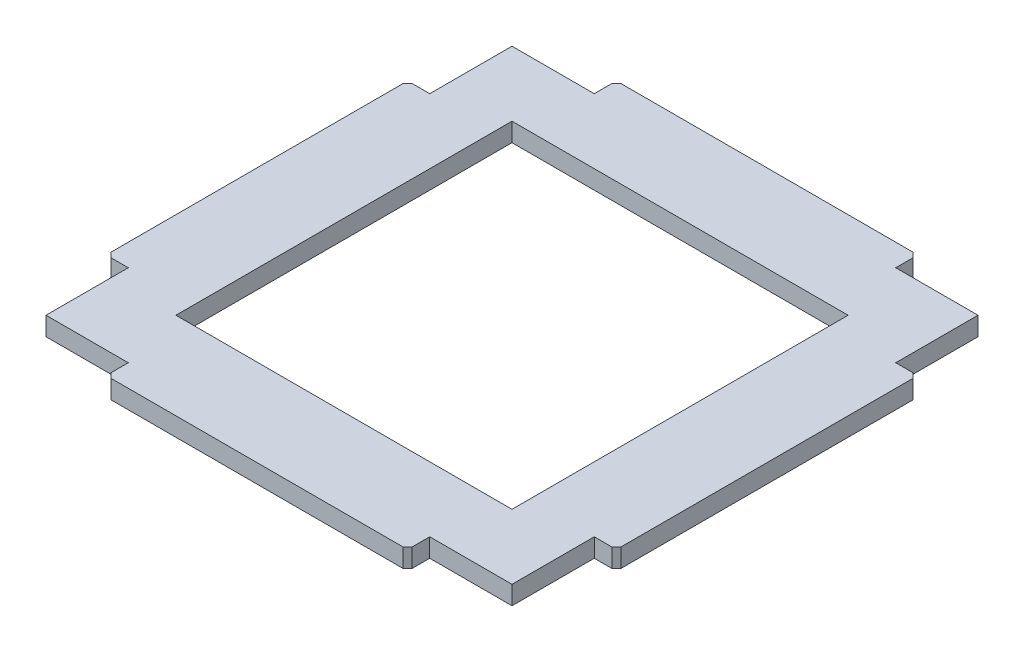
ISO-10303-21;
HEADER;
FILE_DESCRIPTION(('STEP AP214'),'2;1');
FILE_NAME('part.step','',(''),(''),'','','');
FILE_SCHEMA(('AUTOMOTIVE_DESIGN { 1 0 10303 214 1 1 1 1 }'));
ENDSEC;
DATA;
#1=APPLICATION_CONTEXT('core data for automotive mechanical design processes');
#2=APPLICATION_PROTOCOL_DEFINITION('international standard','automotive_design',2000,#1);
#3=PRODUCT_CONTEXT('',#1,'mechanical');
#4=PRODUCT('Part','Part','',(#3));
#5=PRODUCT_RELATED_PRODUCT_CATEGORY('part','',(#4));
#6=PRODUCT_DEFINITION_FORMATION('','',#4);
#7=PRODUCT_DEFINITION_CONTEXT('part definition',#1,'design');
#8=PRODUCT_DEFINITION('design','',#6,#7);
#9=PRODUCT_DEFINITION_SHAPE('','',#8);
#10=(LENGTH_UNIT() NAMED_UNIT(*) SI_UNIT(.MILLI.,.METRE.));
#11=(NAMED_UNIT(*) PLANE_ANGLE_UNIT() SI_UNIT($,.RADIAN.));
#12=(NAMED_UNIT(*) SI_UNIT($,.STERADIAN.) SOLID_ANGLE_UNIT());
#13=UNCERTAINTY_MEASURE_WITH_UNIT(LENGTH_MEASURE(1.E-05),#10,'distance_accuracy_value','');
#14=(GEOMETRIC_REPRESENTATION_CONTEXT(3) GLOBAL_UNCERTAINTY_ASSIGNED_CONTEXT((#13)) GLOBAL_UNIT_ASSIGNED_CONTEXT((#10,
#11,#12)) REPRESENTATION_CONTEXT('',''));
#15=CARTESIAN_POINT('',(0.,0.,0.));
#16=DIRECTION('',(0.,0.,1.));
#17=DIRECTION('',(1.,0.,0.));
#18=AXIS2_PLACEMENT_3D('',#15,#16,#17);
#19=CARTESIAN_POINT('',(0.,4.064,0.));
#20=DIRECTION('',(0.,-1.,0.));
#21=DIRECTION('',(0.,0.,-1.));
#22=AXIS2_PLACEMENT_3D('',#19,#20,#21);
#23=PLANE('',#22);
#24=DIRECTION('',(0.,0.,1.));
#25=VECTOR('',#24,1.);
#26=CARTESIAN_POINT('',(532.384,4.064,-32.8612499999997));
#27=LINE('',#26,#25);
#28=CARTESIAN_POINT('',(532.384,4.064,-31.8452499999997));
#29=VERTEX_POINT('',#28);
#30=CARTESIAN_POINT('',(532.384,4.064,31.8452499999997));
#31=VERTEX_POINT('',#30);
#32=EDGE_CURVE('E320',#29,#31,#27,.T.);
#33=ORIENTED_EDGE('',*,*,#32,.T.);
#34=DIRECTION('',(-0.707106781186557,0.,-0.707106781186538));
#35=VECTOR('',#34,1.);
#36=CARTESIAN_POINT('',(533.4,4.064,32.8612499999997));
#37=LINE('',#36,#35);
#38=CARTESIAN_POINT('',(533.4,4.064,32.8612499999997));
#39=VERTEX_POINT('',#38);
#40=EDGE_CURVE('E455',#31,#39,#37,.F.);
#41=ORIENTED_EDGE('',*,*,#40,.T.);
#42=DIRECTION('',(1.,0.,0.));
#43=VECTOR('',#42,1.);
#44=CARTESIAN_POINT('',(532.384,4.064,32.8612499999997));
#45=LINE('',#44,#43);
#46=CARTESIAN_POINT('',(537.21,4.064,32.8612499999997));
#47=VERTEX_POINT('',#46);
#48=EDGE_CURVE('E323',#39,#47,#45,.T.);
#49=ORIENTED_EDGE('',*,*,#48,.T.);
#50=DIRECTION('',(0.,0.,1.));
#51=VECTOR('',#50,1.);
#52=CARTESIAN_POINT('',(537.21,4.064,50.8));
#53=LINE('',#52,#51);
#54=CARTESIAN_POINT('',(537.21,4.064,50.8));
#55=VERTEX_POINT('',#54);
#56=EDGE_CURVE('E325',#47,#55,#53,.T.);
#57=ORIENTED_EDGE('',*,*,#56,.T.);
#58=DIRECTION('',(1.,0.,0.));
#59=VECTOR('',#58,1.);
#60=CARTESIAN_POINT('',(555.148750000001,4.064,50.8));
#61=LINE('',#60,#59);
#62=CARTESIAN_POINT('',(555.148750000001,4.064,50.8));
#63=VERTEX_POINT('',#62);
#64=EDGE_CURVE('E327',#55,#63,#61,.T.);
#65=ORIENTED_EDGE('',*,*,#64,.T.);
#66=DIRECTION('',(0.,0.,1.));
#67=VECTOR('',#66,1.);
#68=CARTESIAN_POINT('',(555.148750000001,4.064,55.626));
#69=LINE('',#68,#67);
#70=CARTESIAN_POINT('',(555.148750000001,4.064,54.61));
#71=VERTEX_POINT('',#70);
#72=EDGE_CURVE('E329',#63,#71,#69,.T.);
#73=ORIENTED_EDGE('',*,*,#72,.T.);
#74=DIRECTION('',(-0.707106781186557,0.,-0.707106781186538));
#75=VECTOR('',#74,1.);
#76=CARTESIAN_POINT('',(556.164750000001,4.064,55.626));
#77=LINE('',#76,#75);
#78=CARTESIAN_POINT('',(556.164750000001,4.064,55.626));
#79=VERTEX_POINT('',#78);
#80=EDGE_CURVE('E453',#71,#79,#77,.F.);
#81=ORIENTED_EDGE('',*,*,#80,.T.);
#82=DIRECTION('',(1.,0.,0.));
#83=VECTOR('',#82,1.);
#84=CARTESIAN_POINT('',(555.148750000001,4.064,55.626));
#85=LINE('',#84,#83);
#86=CARTESIAN_POINT('',(619.85525,4.064,55.626));
#87=VERTEX_POINT('',#86);
#88=EDGE_CURVE('E332',#79,#87,#85,.T.);
#89=ORIENTED_EDGE('',*,*,#88,.T.);
#90=DIRECTION('',(-0.707106781186538,0.,0.707106781186557));
#91=VECTOR('',#90,1.);
#92=CARTESIAN_POINT('',(620.87125,4.064,54.6099999999999));
#93=LINE('',#92,#91);
#94=CARTESIAN_POINT('',(620.87125,4.064,54.6099999999999));
#95=VERTEX_POINT('',#94);
#96=EDGE_CURVE('E49',#87,#95,#93,.F.);
#97=ORIENTED_EDGE('',*,*,#96,.T.);
#98=DIRECTION('',(0.,0.,-1.));
#99=VECTOR('',#98,1.);
#100=CARTESIAN_POINT('',(620.87125,4.064,55.626));
#101=LINE('',#100,#99);
#102=CARTESIAN_POINT('',(620.87125,4.064,50.8));
#103=VERTEX_POINT('',#102);
#104=EDGE_CURVE('E334',#95,#103,#101,.T.);
#105=ORIENTED_EDGE('',*,*,#104,.T.);
#106=DIRECTION('',(1.,0.,0.));
#107=VECTOR('',#106,1.);
#108=CARTESIAN_POINT('',(638.810000000001,4.064,50.8));
#109=LINE('',#108,#107);
#110=CARTESIAN_POINT('',(638.810000000001,4.064,50.8));
#111=VERTEX_POINT('',#110);
#112=EDGE_CURVE('E287',#103,#111,#109,.T.);
#113=ORIENTED_EDGE('',*,*,#112,.T.);
#114=DIRECTION('',(0.,0.,-1.));
#115=VECTOR('',#114,1.);
#116=CARTESIAN_POINT('',(638.81,4.064,32.8612499999997));
#117=LINE('',#116,#115);
#118=CARTESIAN_POINT('',(638.81,4.064,32.8612499999997));
#119=VERTEX_POINT('',#118);
#120=EDGE_CURVE('E290',#111,#119,#117,.T.);
#121=ORIENTED_EDGE('',*,*,#120,.T.);
#122=DIRECTION('',(1.,0.,0.));
#123=VECTOR('',#122,1.);
#124=CARTESIAN_POINT('',(643.636,4.064,32.8612499999997));
#125=LINE('',#124,#123);
#126=CARTESIAN_POINT('',(642.62,4.064,32.8612499999997));
#127=VERTEX_POINT('',#126);
#128=EDGE_CURVE('E293',#119,#127,#125,.T.);
#129=ORIENTED_EDGE('',*,*,#128,.T.);
#130=DIRECTION('',(-0.707106781186538,0.,0.707106781186557));
#131=VECTOR('',#130,1.);
#132=CARTESIAN_POINT('',(643.636,4.064,31.8452499999996));
#133=LINE('',#132,#131);
#134=CARTESIAN_POINT('',(643.636,4.064,31.8452499999996));
#135=VERTEX_POINT('',#134);
#136=EDGE_CURVE('E450',#127,#135,#133,.F.);
#137=ORIENTED_EDGE('',*,*,#136,.T.);
#138=DIRECTION('',(0.,0.,-1.));
#139=VECTOR('',#138,1.);
#140=CARTESIAN_POINT('',(643.636,4.064,32.8612499999997));
#141=LINE('',#140,#139);
#142=CARTESIAN_POINT('',(643.636,4.064,-31.8452499999997));
#143=VERTEX_POINT('',#142);
#144=EDGE_CURVE('E296',#135,#143,#141,.T.);
#145=ORIENTED_EDGE('',*,*,#144,.T.);
#146=DIRECTION('',(0.707106781186538,0.,0.707106781186557));
#147=VECTOR('',#146,1.);
#148=CARTESIAN_POINT('',(642.62,4.064,-32.8612499999997));
#149=LINE('',#148,#147);
#150=CARTESIAN_POINT('',(642.62,4.064,-32.8612499999997));
#151=VERTEX_POINT('',#150);
#152=EDGE_CURVE('E448',#143,#151,#149,.F.);
#153=ORIENTED_EDGE('',*,*,#152,.T.);
#154=DIRECTION('',(-1.,0.,0.));
#155=VECTOR('',#154,1.);
#156=CARTESIAN_POINT('',(643.636,4.064,-32.8612499999997));
#157=LINE('',#156,#155);
#158=CARTESIAN_POINT('',(638.81,4.064,-32.8612499999997));
#159=VERTEX_POINT('',#158);
#160=EDGE_CURVE('E299',#151,#159,#157,.T.);
#161=ORIENTED_EDGE('',*,*,#160,.T.);
#162=DIRECTION('',(0.,0.,-1.));
#163=VECTOR('',#162,1.);
#164=CARTESIAN_POINT('',(638.810000000001,4.064,-50.8));
#165=LINE('',#164,#163);
#166=CARTESIAN_POINT('',(638.810000000001,4.064,-50.8));
#167=VERTEX_POINT('',#166);
#168=EDGE_CURVE('E301',#159,#167,#165,.T.);
#169=ORIENTED_EDGE('',*,*,#168,.T.);
#170=DIRECTION('',(-1.,0.,0.));
#171=VECTOR('',#170,1.);
#172=CARTESIAN_POINT('',(620.87125,4.064,-50.8));
#173=LINE('',#172,#171);
#174=CARTESIAN_POINT('',(620.87125,4.064,-50.8));
#175=VERTEX_POINT('',#174);
#176=EDGE_CURVE('E303',#167,#175,#173,.T.);
#177=ORIENTED_EDGE('',*,*,#176,.T.);
#178=DIRECTION('',(0.,0.,-1.));
#179=VECTOR('',#178,1.);
#180=CARTESIAN_POINT('',(620.87125,4.064,-55.626));
#181=LINE('',#180,#179);
#182=CARTESIAN_POINT('',(620.87125,4.064,-54.6099999999999));
#183=VERTEX_POINT('',#182);
#184=EDGE_CURVE('E305',#175,#183,#181,.T.);
#185=ORIENTED_EDGE('',*,*,#184,.T.);
#186=DIRECTION('',(0.707106781186538,0.,0.707106781186557));
#187=VECTOR('',#186,1.);
#188=CARTESIAN_POINT('',(619.85525,4.064,-55.626));
#189=LINE('',#188,#187);
#190=CARTESIAN_POINT('',(619.85525,4.064,-55.626));
#191=VERTEX_POINT('',#190);
#192=EDGE_CURVE('E446',#183,#191,#189,.F.);
#193=ORIENTED_EDGE('',*,*,#192,.T.);
#194=DIRECTION('',(-1.,0.,0.));
#195=VECTOR('',#194,1.);
#196=CARTESIAN_POINT('',(555.148750000001,4.064,-55.626));
#197=LINE('',#196,#195);
#198=CARTESIAN_POINT('',(556.164750000001,4.064,-55.626));
#199=VERTEX_POINT('',#198);
#200=EDGE_CURVE('E308',#191,#199,#197,.T.);
#201=ORIENTED_EDGE('',*,*,#200,.T.);
#202=DIRECTION('',(0.707106781186543,0.,-0.707106781186552));
#203=VECTOR('',#202,1.);
#204=CARTESIAN_POINT('',(555.148750000001,4.064,-54.61));
#205=LINE('',#204,#203);
#206=CARTESIAN_POINT('',(555.148750000001,4.064,-54.61));
#207=VERTEX_POINT('',#206);
#208=EDGE_CURVE('E442',#199,#207,#205,.F.);
#209=ORIENTED_EDGE('',*,*,#208,.T.);
#210=DIRECTION('',(0.,0.,1.));
#211=VECTOR('',#210,1.);
#212=CARTESIAN_POINT('',(555.148750000001,4.064,-55.626));
#213=LINE('',#212,#211);
#214=CARTESIAN_POINT('',(555.148750000001,4.064,-50.8));
#215=VERTEX_POINT('',#214);
#216=EDGE_CURVE('E311',#207,#215,#213,.T.);
#217=ORIENTED_EDGE('',*,*,#216,.T.);
#218=DIRECTION('',(-1.,0.,0.));
#219=VECTOR('',#218,1.);
#220=CARTESIAN_POINT('',(537.21,4.064,-50.8));
#221=LINE('',#220,#219);
#222=CARTESIAN_POINT('',(537.21,4.064,-50.8));
#223=VERTEX_POINT('',#222);
#224=EDGE_CURVE('E313',#215,#223,#221,.T.);
#225=ORIENTED_EDGE('',*,*,#224,.T.);
#226=DIRECTION('',(0.,0.,1.));
#227=VECTOR('',#226,1.);
#228=CARTESIAN_POINT('',(537.21,4.064,-32.8612499999997));
#229=LINE('',#228,#227);
#230=CARTESIAN_POINT('',(537.21,4.064,-32.8612499999997));
#231=VERTEX_POINT('',#230);
#232=EDGE_CURVE('E315',#223,#231,#229,.T.);
#233=ORIENTED_EDGE('',*,*,#232,.T.);
#234=DIRECTION('',(-1.,0.,0.));
#235=VECTOR('',#234,1.);
#236=CARTESIAN_POINT('',(532.384,4.064,-32.8612499999997));
#237=LINE('',#236,#235);
#238=CARTESIAN_POINT('',(533.4,4.064,-32.8612499999997));
#239=VERTEX_POINT('',#238);
#240=EDGE_CURVE('E317',#231,#239,#237,.T.);
#241=ORIENTED_EDGE('',*,*,#240,.T.);
#242=DIRECTION('',(0.707106781186538,0.,-0.707106781186557));
#243=VECTOR('',#242,1.);
#244=CARTESIAN_POINT('',(532.384,4.064,-31.8452499999997));
#245=LINE('',#244,#243);
#246=EDGE_CURVE('E444',#239,#29,#245,.F.);
#247=ORIENTED_EDGE('',*,*,#246,.T.);
#248=EDGE_LOOP('',(#33,#41,#49,#57,#65,#73,#81,#89,#97,#105,#113,#121,#129,#137,#145,#153,#161,
#169,#177,#185,#193,#201,#209,#217,#225,#233,#241,#247));
#249=FACE_BOUND('',#248,.T.);
#250=DIRECTION('',(0.,0.,1.));
#251=VECTOR('',#250,1.);
#252=CARTESIAN_POINT('',(551.370500000001,4.064,-36.6395));
#253=LINE('',#252,#251);
#254=CARTESIAN_POINT('',(551.370500000001,4.064,-36.6395));
#255=VERTEX_POINT('',#254);
#256=CARTESIAN_POINT('',(551.370500000001,4.064,36.6395));
#257=VERTEX_POINT('',#256);
#258=EDGE_CURVE('E246',#255,#257,#253,.T.);
#259=ORIENTED_EDGE('',*,*,#258,.F.);
#260=DIRECTION('',(-1.,0.,0.));
#261=VECTOR('',#260,1.);
#262=CARTESIAN_POINT('',(624.649500000001,4.064,-36.6395));
#263=LINE('',#262,#261);
#264=CARTESIAN_POINT('',(624.649500000001,4.064,-36.6395));
#265=VERTEX_POINT('',#264);
#266=EDGE_CURVE('E271',#265,#255,#263,.T.);
#267=ORIENTED_EDGE('',*,*,#266,.F.);
#268=DIRECTION('',(0.,0.,-1.));
#269=VECTOR('',#268,1.);
#270=CARTESIAN_POINT('',(624.649500000001,4.064,-36.6395));
#271=LINE('',#270,#269);
#272=CARTESIAN_POINT('',(624.649500000001,4.064,36.6395));
#273=VERTEX_POINT('',#272);
#274=EDGE_CURVE('E269',#273,#265,#271,.T.);
#275=ORIENTED_EDGE('',*,*,#274,.F.);
#276=DIRECTION('',(1.,0.,0.));
#277=VECTOR('',#276,1.);
#278=CARTESIAN_POINT('',(624.649500000001,4.064,36.6395));
#279=LINE('',#278,#277);
#280=EDGE_CURVE('E256',#257,#273,#279,.T.);
#281=ORIENTED_EDGE('',*,*,#280,.F.);
#282=EDGE_LOOP('',(#259,#267,#275,#281));
#283=FACE_BOUND('',#282,.T.);
#284=ADVANCED_FACE('F34',(#249,#283),#23,.F.);
#285=CARTESIAN_POINT('',(0.,0.,0.));
#286=DIRECTION('',(0.,-1.,0.));
#287=DIRECTION('',(0.,0.,-1.));
#288=AXIS2_PLACEMENT_3D('',#285,#286,#287);
#289=PLANE('',#288);
#290=DIRECTION('',(1.,0.,0.));
#291=VECTOR('',#290,1.);
#292=CARTESIAN_POINT('',(532.384,0.,32.8612499999997));
#293=LINE('',#292,#291);
#294=CARTESIAN_POINT('',(533.4,0.,32.8612499999997));
#295=VERTEX_POINT('',#294);
#296=CARTESIAN_POINT('',(537.21,0.,32.8612499999997));
#297=VERTEX_POINT('',#296);
#298=EDGE_CURVE('E371',#295,#297,#293,.T.);
#299=ORIENTED_EDGE('',*,*,#298,.F.);
#300=DIRECTION('',(0.707106781186557,0.,0.707106781186538));
#301=VECTOR('',#300,1.);
#302=CARTESIAN_POINT('',(250.269374999993,0.,-250.269375));
#303=LINE('',#302,#301);
#304=CARTESIAN_POINT('',(532.384,0.,31.8452499999997));
#305=VERTEX_POINT('',#304);
#306=EDGE_CURVE('E435',#295,#305,#303,.F.);
#307=ORIENTED_EDGE('',*,*,#306,.T.);
#308=DIRECTION('',(0.,0.,1.));
#309=VECTOR('',#308,1.);
#310=CARTESIAN_POINT('',(532.384,0.,-32.8612499999997));
#311=LINE('',#310,#309);
#312=CARTESIAN_POINT('',(532.384,0.,-31.8452499999997));
#313=VERTEX_POINT('',#312);
#314=EDGE_CURVE('E368',#313,#305,#311,.T.);
#315=ORIENTED_EDGE('',*,*,#314,.F.);
#316=DIRECTION('',(-0.707106781186538,0.,0.707106781186557));
#317=VECTOR('',#316,1.);
#318=CARTESIAN_POINT('',(250.269375000008,0.,250.269375000001));
#319=LINE('',#318,#317);
#320=CARTESIAN_POINT('',(533.4,0.,-32.8612499999997));
#321=VERTEX_POINT('',#320);
#322=EDGE_CURVE('E423',#313,#321,#319,.F.);
#323=ORIENTED_EDGE('',*,*,#322,.T.);
#324=DIRECTION('',(-1.,0.,0.));
#325=VECTOR('',#324,1.);
#326=CARTESIAN_POINT('',(532.384,0.,-32.8612499999997));
#327=LINE('',#326,#325);
#328=CARTESIAN_POINT('',(537.21,0.,-32.8612499999997));
#329=VERTEX_POINT('',#328);
#330=EDGE_CURVE('E365',#329,#321,#327,.T.);
#331=ORIENTED_EDGE('',*,*,#330,.F.);
#332=DIRECTION('',(0.,0.,1.));
#333=VECTOR('',#332,1.);
#334=CARTESIAN_POINT('',(537.21,0.,-32.8612499999997));
#335=LINE('',#334,#333);
#336=CARTESIAN_POINT('',(537.21,0.,-50.8));
#337=VERTEX_POINT('',#336);
#338=EDGE_CURVE('E363',#337,#329,#335,.T.);
#339=ORIENTED_EDGE('',*,*,#338,.F.);
#340=DIRECTION('',(-1.,0.,0.));
#341=VECTOR('',#340,1.);
#342=CARTESIAN_POINT('',(537.21,0.,-50.8));
#343=LINE('',#342,#341);
#344=CARTESIAN_POINT('',(555.148750000001,0.,-50.8));
#345=VERTEX_POINT('',#344);
#346=EDGE_CURVE('E361',#345,#337,#343,.T.);
#347=ORIENTED_EDGE('',*,*,#346,.F.);
#348=DIRECTION('',(0.,0.,1.));
#349=VECTOR('',#348,1.);
#350=CARTESIAN_POINT('',(555.148750000001,0.,-55.626));
#351=LINE('',#350,#349);
#352=CARTESIAN_POINT('',(555.148750000001,0.,-54.61));
#353=VERTEX_POINT('',#352);
#354=EDGE_CURVE('E359',#353,#345,#351,.T.);
#355=ORIENTED_EDGE('',*,*,#354,.F.);
#356=DIRECTION('',(-0.707106781186543,0.,0.707106781186552));
#357=VECTOR('',#356,1.);
#358=CARTESIAN_POINT('',(250.269375000004,0.,250.269375000001));
#359=LINE('',#358,#357);
#360=CARTESIAN_POINT('',(556.164750000001,0.,-55.626));
#361=VERTEX_POINT('',#360);
#362=EDGE_CURVE('E421',#353,#361,#359,.F.);
#363=ORIENTED_EDGE('',*,*,#362,.T.);
#364=DIRECTION('',(-1.,0.,0.));
#365=VECTOR('',#364,1.);
#366=CARTESIAN_POINT('',(555.148750000001,0.,-55.626));
#367=LINE('',#366,#365);
#368=CARTESIAN_POINT('',(619.85525,0.,-55.626));
#369=VERTEX_POINT('',#368);
#370=EDGE_CURVE('E356',#369,#361,#367,.T.);
#371=ORIENTED_EDGE('',*,*,#370,.F.);
#372=DIRECTION('',(-0.707106781186538,0.,-0.707106781186557));
#373=VECTOR('',#372,1.);
#374=CARTESIAN_POINT('',(337.740625000008,0.,-337.740624999999));
#375=LINE('',#374,#373);
#376=CARTESIAN_POINT('',(620.87125,0.,-54.6099999999999));
#377=VERTEX_POINT('',#376);
#378=EDGE_CURVE('E425',#369,#377,#375,.F.);
#379=ORIENTED_EDGE('',*,*,#378,.T.);
#380=DIRECTION('',(0.,0.,-1.));
#381=VECTOR('',#380,1.);
#382=CARTESIAN_POINT('',(620.87125,0.,-55.626));
#383=LINE('',#382,#381);
#384=CARTESIAN_POINT('',(620.87125,0.,-50.8));
#385=VERTEX_POINT('',#384);
#386=EDGE_CURVE('E353',#385,#377,#383,.T.);
#387=ORIENTED_EDGE('',*,*,#386,.F.);
#388=DIRECTION('',(-1.,0.,0.));
#389=VECTOR('',#388,1.);
#390=CARTESIAN_POINT('',(620.87125,0.,-50.8));
#391=LINE('',#390,#389);
#392=CARTESIAN_POINT('',(638.810000000001,0.,-50.8));
#393=VERTEX_POINT('',#392);
#394=EDGE_CURVE('E351',#393,#385,#391,.T.);
#395=ORIENTED_EDGE('',*,*,#394,.F.);
#396=DIRECTION('',(0.,0.,-1.));
#397=VECTOR('',#396,1.);
#398=CARTESIAN_POINT('',(638.810000000001,0.,-50.8));
#399=LINE('',#398,#397);
#400=CARTESIAN_POINT('',(638.81,0.,-32.8612499999997));
#401=VERTEX_POINT('',#400);
#402=EDGE_CURVE('E349',#401,#393,#399,.T.);
#403=ORIENTED_EDGE('',*,*,#402,.F.);
#404=DIRECTION('',(-1.,0.,0.));
#405=VECTOR('',#404,1.);
#406=CARTESIAN_POINT('',(643.636,0.,-32.8612499999997));
#407=LINE('',#406,#405);
#408=CARTESIAN_POINT('',(642.62,0.,-32.8612499999997));
#409=VERTEX_POINT('',#408);
#410=EDGE_CURVE('E347',#409,#401,#407,.T.);
#411=ORIENTED_EDGE('',*,*,#410,.F.);
#412=DIRECTION('',(-0.707106781186538,0.,-0.707106781186557));
#413=VECTOR('',#412,1.);
#414=CARTESIAN_POINT('',(337.740625000009,0.,-337.740625));
#415=LINE('',#414,#413);
#416=CARTESIAN_POINT('',(643.636,0.,-31.8452499999997));
#417=VERTEX_POINT('',#416);
#418=EDGE_CURVE('E427',#409,#417,#415,.F.);
#419=ORIENTED_EDGE('',*,*,#418,.T.);
#420=DIRECTION('',(0.,0.,-1.));
#421=VECTOR('',#420,1.);
#422=CARTESIAN_POINT('',(643.636,0.,32.8612499999997));
#423=LINE('',#422,#421);
#424=CARTESIAN_POINT('',(643.636,0.,31.8452499999996));
#425=VERTEX_POINT('',#424);
#426=EDGE_CURVE('E344',#425,#417,#423,.T.);
#427=ORIENTED_EDGE('',*,*,#426,.F.);
#428=DIRECTION('',(0.707106781186538,0.,-0.707106781186557));
#429=VECTOR('',#428,1.);
#430=CARTESIAN_POINT('',(337.740625000009,0.,337.740625));
#431=LINE('',#430,#429);
#432=CARTESIAN_POINT('',(642.62,0.,32.8612499999997));
#433=VERTEX_POINT('',#432);
#434=EDGE_CURVE('E429',#425,#433,#431,.F.);
#435=ORIENTED_EDGE('',*,*,#434,.T.);
#436=DIRECTION('',(1.,0.,0.));
#437=VECTOR('',#436,1.);
#438=CARTESIAN_POINT('',(643.636,0.,32.8612499999997));
#439=LINE('',#438,#437);
#440=CARTESIAN_POINT('',(638.81,0.,32.8612499999997));
#441=VERTEX_POINT('',#440);
#442=EDGE_CURVE('E341',#441,#433,#439,.T.);
#443=ORIENTED_EDGE('',*,*,#442,.F.);
#444=DIRECTION('',(0.,0.,-1.));
#445=VECTOR('',#444,1.);
#446=CARTESIAN_POINT('',(638.81,0.,32.8612499999997));
#447=LINE('',#446,#445);
#448=CARTESIAN_POINT('',(638.810000000001,0.,50.8));
#449=VERTEX_POINT('',#448);
#450=EDGE_CURVE('E339',#449,#441,#447,.T.);
#451=ORIENTED_EDGE('',*,*,#450,.F.);
#452=DIRECTION('',(1.,0.,0.));
#453=VECTOR('',#452,1.);
#454=CARTESIAN_POINT('',(638.810000000001,0.,50.8));
#455=LINE('',#454,#453);
#456=CARTESIAN_POINT('',(620.87125,0.,50.8));
#457=VERTEX_POINT('',#456);
#458=EDGE_CURVE('E264',#457,#449,#455,.T.);
#459=ORIENTED_EDGE('',*,*,#458,.F.);
#460=DIRECTION('',(0.,0.,-1.));
#461=VECTOR('',#460,1.);
#462=CARTESIAN_POINT('',(620.87125,0.,55.626));
#463=LINE('',#462,#461);
#464=CARTESIAN_POINT('',(620.87125,0.,54.6099999999999));
#465=VERTEX_POINT('',#464);
#466=EDGE_CURVE('E291',#465,#457,#463,.T.);
#467=ORIENTED_EDGE('',*,*,#466,.F.);
#468=DIRECTION('',(0.707106781186538,0.,-0.707106781186557));
#469=VECTOR('',#468,1.);
#470=CARTESIAN_POINT('',(337.740625000008,0.,337.740624999999));
#471=LINE('',#470,#469);
#472=CARTESIAN_POINT('',(619.85525,0.,55.626));
#473=VERTEX_POINT('',#472);
#474=EDGE_CURVE('E431',#465,#473,#471,.F.);
#475=ORIENTED_EDGE('',*,*,#474,.T.);
#476=DIRECTION('',(1.,0.,0.));
#477=VECTOR('',#476,1.);
#478=CARTESIAN_POINT('',(555.148750000001,0.,55.626));
#479=LINE('',#478,#477);
#480=CARTESIAN_POINT('',(556.164750000001,0.,55.626));
#481=VERTEX_POINT('',#480);
#482=EDGE_CURVE('E380',#481,#473,#479,.T.);
#483=ORIENTED_EDGE('',*,*,#482,.F.);
#484=DIRECTION('',(0.707106781186557,0.,0.707106781186538));
#485=VECTOR('',#484,1.);
#486=CARTESIAN_POINT('',(250.269374999993,0.,-250.269375));
#487=LINE('',#486,#485);
#488=CARTESIAN_POINT('',(555.148750000001,0.,54.61));
#489=VERTEX_POINT('',#488);
#490=EDGE_CURVE('E433',#481,#489,#487,.F.);
#491=ORIENTED_EDGE('',*,*,#490,.T.);
#492=DIRECTION('',(0.,0.,1.));
#493=VECTOR('',#492,1.);
#494=CARTESIAN_POINT('',(555.148750000001,0.,55.626));
#495=LINE('',#494,#493);
#496=CARTESIAN_POINT('',(555.148750000001,0.,50.8));
#497=VERTEX_POINT('',#496);
#498=EDGE_CURVE('E377',#497,#489,#495,.T.);
#499=ORIENTED_EDGE('',*,*,#498,.F.);
#500=DIRECTION('',(1.,0.,0.));
#501=VECTOR('',#500,1.);
#502=CARTESIAN_POINT('',(555.148750000001,0.,50.8));
#503=LINE('',#502,#501);
#504=CARTESIAN_POINT('',(537.21,0.,50.8));
#505=VERTEX_POINT('',#504);
#506=EDGE_CURVE('E375',#505,#497,#503,.T.);
#507=ORIENTED_EDGE('',*,*,#506,.F.);
#508=DIRECTION('',(0.,0.,1.));
#509=VECTOR('',#508,1.);
#510=CARTESIAN_POINT('',(537.21,0.,50.8));
#511=LINE('',#510,#509);
#512=EDGE_CURVE('E373',#297,#505,#511,.T.);
#513=ORIENTED_EDGE('',*,*,#512,.F.);
#514=EDGE_LOOP('',(#299,#307,#315,#323,#331,#339,#347,#355,#363,#371,#379,#387,#395,#403,#411,
#419,#427,#435,#443,#451,#459,#467,#475,#483,#491,#499,#507,#513));
#515=FACE_BOUND('',#514,.T.);
#516=DIRECTION('',(-1.,0.,0.));
#517=VECTOR('',#516,1.);
#518=CARTESIAN_POINT('',(624.649500000001,0.,-36.6395));
#519=LINE('',#518,#517);
#520=CARTESIAN_POINT('',(624.649500000001,0.,-36.6395));
#521=VERTEX_POINT('',#520);
#522=CARTESIAN_POINT('',(551.370500000001,0.,-36.6395));
#523=VERTEX_POINT('',#522);
#524=EDGE_CURVE('E257',#521,#523,#519,.T.);
#525=ORIENTED_EDGE('',*,*,#524,.T.);
#526=DIRECTION('',(0.,0.,1.));
#527=VECTOR('',#526,1.);
#528=CARTESIAN_POINT('',(551.370500000001,0.,-36.6395));
#529=LINE('',#528,#527);
#530=CARTESIAN_POINT('',(551.370500000001,0.,36.6395));
#531=VERTEX_POINT('',#530);
#532=EDGE_CURVE('E275',#523,#531,#529,.T.);
#533=ORIENTED_EDGE('',*,*,#532,.T.);
#534=DIRECTION('',(1.,0.,0.));
#535=VECTOR('',#534,1.);
#536=CARTESIAN_POINT('',(624.649500000001,0.,36.6395));
#537=LINE('',#536,#535);
#538=CARTESIAN_POINT('',(624.649500000001,0.,36.6395));
#539=VERTEX_POINT('',#538);
#540=EDGE_CURVE('E263',#531,#539,#537,.T.);
#541=ORIENTED_EDGE('',*,*,#540,.T.);
#542=DIRECTION('',(0.,0.,-1.));
#543=VECTOR('',#542,1.);
#544=CARTESIAN_POINT('',(624.649500000001,0.,-36.6395));
#545=LINE('',#544,#543);
#546=EDGE_CURVE('E278',#539,#521,#545,.T.);
#547=ORIENTED_EDGE('',*,*,#546,.T.);
#548=EDGE_LOOP('',(#525,#533,#541,#547));
#549=FACE_BOUND('',#548,.T.);
#550=ADVANCED_FACE('F500',(#515,#549),#289,.T.);
#551=CARTESIAN_POINT('',(638.810000000001,4.064,50.8));
#552=DIRECTION('',(0.,0.,-1.));
#553=DIRECTION('',(-1.,0.,0.));
#554=AXIS2_PLACEMENT_3D('',#551,#552,#553);
#555=PLANE('',#554);
#556=ORIENTED_EDGE('',*,*,#458,.T.);
#557=DIRECTION('',(0.,-1.,0.));
#558=VECTOR('',#557,1.);
#559=CARTESIAN_POINT('',(638.810000000001,4.064,50.8));
#560=LINE('',#559,#558);
#561=EDGE_CURVE('E415',#111,#449,#560,.T.);
#562=ORIENTED_EDGE('',*,*,#561,.F.);
#563=ORIENTED_EDGE('',*,*,#112,.F.);
#564=DIRECTION('',(0.,-1.,0.));
#565=VECTOR('',#564,1.);
#566=CARTESIAN_POINT('',(620.87125,4.064,50.8));
#567=LINE('',#566,#565);
#568=EDGE_CURVE('E336',#103,#457,#567,.T.);
#569=ORIENTED_EDGE('',*,*,#568,.T.);
#570=EDGE_LOOP('',(#556,#562,#563,#569));
#571=FACE_BOUND('',#570,.T.);
#572=ADVANCED_FACE('F543',(#571),#555,.F.);
#573=CARTESIAN_POINT('',(638.81,4.064,32.8612499999997));
#574=DIRECTION('',(-1.,0.,0.));
#575=DIRECTION('',(0.,0.,1.));
#576=AXIS2_PLACEMENT_3D('',#573,#574,#575);
#577=PLANE('',#576);
#578=ORIENTED_EDGE('',*,*,#450,.T.);
#579=DIRECTION('',(0.,-1.,0.));
#580=VECTOR('',#579,1.);
#581=CARTESIAN_POINT('',(638.81,4.064,32.8612499999997));
#582=LINE('',#581,#580);
#583=EDGE_CURVE('E412',#119,#441,#582,.T.);
#584=ORIENTED_EDGE('',*,*,#583,.F.);
#585=ORIENTED_EDGE('',*,*,#120,.F.);
#586=ORIENTED_EDGE('',*,*,#561,.T.);
#587=EDGE_LOOP('',(#578,#584,#585,#586));
#588=FACE_BOUND('',#587,.T.);
#589=ADVANCED_FACE('F545',(#588),#577,.F.);
#590=CARTESIAN_POINT('',(643.636,4.064,32.8612499999997));
#591=DIRECTION('',(0.,0.,-1.));
#592=DIRECTION('',(-1.,0.,0.));
#593=AXIS2_PLACEMENT_3D('',#590,#591,#592);
#594=PLANE('',#593);
#595=ORIENTED_EDGE('',*,*,#442,.T.);
#596=DIRECTION('',(0.,1.,0.));
#597=VECTOR('',#596,1.);
#598=CARTESIAN_POINT('',(642.62,4.064,32.8612499999997));
#599=LINE('',#598,#597);
#600=EDGE_CURVE('E471',#433,#127,#599,.T.);
#601=ORIENTED_EDGE('',*,*,#600,.T.);
#602=ORIENTED_EDGE('',*,*,#128,.F.);
#603=ORIENTED_EDGE('',*,*,#583,.T.);
#604=EDGE_LOOP('',(#595,#601,#602,#603));
#605=FACE_BOUND('',#604,.T.);
#606=ADVANCED_FACE('F549',(#605),#594,.F.);
#607=CARTESIAN_POINT('',(643.636,4.064,32.8612499999997));
#608=DIRECTION('',(-1.,0.,0.));
#609=DIRECTION('',(0.,0.,1.));
#610=AXIS2_PLACEMENT_3D('',#607,#608,#609);
#611=PLANE('',#610);
#612=ORIENTED_EDGE('',*,*,#144,.F.);
#613=DIRECTION('',(0.,-1.,0.));
#614=VECTOR('',#613,1.);
#615=CARTESIAN_POINT('',(643.636,4.064,31.8452499999996));
#616=LINE('',#615,#614);
#617=EDGE_CURVE('E468',#135,#425,#616,.T.);
#618=ORIENTED_EDGE('',*,*,#617,.T.);
#619=ORIENTED_EDGE('',*,*,#426,.T.);
#620=DIRECTION('',(0.,1.,0.));
#621=VECTOR('',#620,1.);
#622=CARTESIAN_POINT('',(643.636,4.064,-31.8452499999997));
#623=LINE('',#622,#621);
#624=EDGE_CURVE('E466',#417,#143,#623,.T.);
#625=ORIENTED_EDGE('',*,*,#624,.T.);
#626=EDGE_LOOP('',(#612,#618,#619,#625));
#627=FACE_BOUND('',#626,.T.);
#628=ADVANCED_FACE('F558',(#627),#611,.F.);
#629=CARTESIAN_POINT('',(643.636,4.064,-32.8612499999997));
#630=DIRECTION('',(0.,0.,1.));
#631=DIRECTION('',(1.,0.,0.));
#632=AXIS2_PLACEMENT_3D('',#629,#630,#631);
#633=PLANE('',#632);
#634=ORIENTED_EDGE('',*,*,#160,.F.);
#635=DIRECTION('',(0.,-1.,0.));
#636=VECTOR('',#635,1.);
#637=CARTESIAN_POINT('',(642.62,4.064,-32.8612499999997));
#638=LINE('',#637,#636);
#639=EDGE_CURVE('E473',#151,#409,#638,.T.);
#640=ORIENTED_EDGE('',*,*,#639,.T.);
#641=ORIENTED_EDGE('',*,*,#410,.T.);
#642=DIRECTION('',(0.,-1.,0.));
#643=VECTOR('',#642,1.);
#644=CARTESIAN_POINT('',(638.81,4.064,-32.8612499999997));
#645=LINE('',#644,#643);
#646=EDGE_CURVE('E409',#159,#401,#645,.T.);
#647=ORIENTED_EDGE('',*,*,#646,.F.);
#648=EDGE_LOOP('',(#634,#640,#641,#647));
#649=FACE_BOUND('',#648,.T.);
#650=ADVANCED_FACE('F568',(#649),#633,.F.);
#651=CARTESIAN_POINT('',(638.810000000001,4.064,-50.8));
#652=DIRECTION('',(-1.,0.,0.));
#653=DIRECTION('',(0.,0.,1.));
#654=AXIS2_PLACEMENT_3D('',#651,#652,#653);
#655=PLANE('',#654);
#656=ORIENTED_EDGE('',*,*,#402,.T.);
#657=DIRECTION('',(0.,-1.,0.));
#658=VECTOR('',#657,1.);
#659=CARTESIAN_POINT('',(638.810000000001,4.064,-50.8));
#660=LINE('',#659,#658);
#661=EDGE_CURVE('E406',#167,#393,#660,.T.);
#662=ORIENTED_EDGE('',*,*,#661,.F.);
#663=ORIENTED_EDGE('',*,*,#168,.F.);
#664=ORIENTED_EDGE('',*,*,#646,.T.);
#665=EDGE_LOOP('',(#656,#662,#663,#664));
#666=FACE_BOUND('',#665,.T.);
#667=ADVANCED_FACE('F575',(#666),#655,.F.);
#668=CARTESIAN_POINT('',(620.87125,4.064,-50.8));
#669=DIRECTION('',(0.,0.,1.));
#670=DIRECTION('',(1.,0.,0.));
#671=AXIS2_PLACEMENT_3D('',#668,#669,#670);
#672=PLANE('',#671);
#673=ORIENTED_EDGE('',*,*,#394,.T.);
#674=DIRECTION('',(0.,-1.,0.));
#675=VECTOR('',#674,1.);
#676=CARTESIAN_POINT('',(620.87125,4.064,-50.8));
#677=LINE('',#676,#675);
#678=EDGE_CURVE('E403',#175,#385,#677,.T.);
#679=ORIENTED_EDGE('',*,*,#678,.F.);
#680=ORIENTED_EDGE('',*,*,#176,.F.);
#681=ORIENTED_EDGE('',*,*,#661,.T.);
#682=EDGE_LOOP('',(#673,#679,#680,#681));
#683=FACE_BOUND('',#682,.T.);
#684=ADVANCED_FACE('F578',(#683),#672,.F.);
#685=CARTESIAN_POINT('',(620.87125,4.064,-55.626));
#686=DIRECTION('',(-1.,0.,0.));
#687=DIRECTION('',(0.,0.,1.));
#688=AXIS2_PLACEMENT_3D('',#685,#686,#687);
#689=PLANE('',#688);
#690=ORIENTED_EDGE('',*,*,#386,.T.);
#691=DIRECTION('',(0.,1.,0.));
#692=VECTOR('',#691,1.);
#693=CARTESIAN_POINT('',(620.87125,4.064,-54.6099999999999));
#694=LINE('',#693,#692);
#695=EDGE_CURVE('E481',#377,#183,#694,.T.);
#696=ORIENTED_EDGE('',*,*,#695,.T.);
#697=ORIENTED_EDGE('',*,*,#184,.F.);
#698=ORIENTED_EDGE('',*,*,#678,.T.);
#699=EDGE_LOOP('',(#690,#696,#697,#698));
#700=FACE_BOUND('',#699,.T.);
#701=ADVANCED_FACE('F582',(#700),#689,.F.);
#702=CARTESIAN_POINT('',(555.148750000001,4.064,-55.626));
#703=DIRECTION('',(0.,0.,1.));
#704=DIRECTION('',(1.,0.,0.));
#705=AXIS2_PLACEMENT_3D('',#702,#703,#704);
#706=PLANE('',#705);
#707=ORIENTED_EDGE('',*,*,#200,.F.);
#708=DIRECTION('',(0.,-1.,0.));
#709=VECTOR('',#708,1.);
#710=CARTESIAN_POINT('',(619.85525,4.064,-55.626));
#711=LINE('',#710,#709);
#712=EDGE_CURVE('E478',#191,#369,#711,.T.);
#713=ORIENTED_EDGE('',*,*,#712,.T.);
#714=ORIENTED_EDGE('',*,*,#370,.T.);
#715=DIRECTION('',(0.,1.,0.));
#716=VECTOR('',#715,1.);
#717=CARTESIAN_POINT('',(556.164750000001,4.064,-55.626));
#718=LINE('',#717,#716);
#719=EDGE_CURVE('E476',#361,#199,#718,.T.);
#720=ORIENTED_EDGE('',*,*,#719,.T.);
#721=EDGE_LOOP('',(#707,#713,#714,#720));
#722=FACE_BOUND('',#721,.T.);
#723=ADVANCED_FACE('F591',(#722),#706,.F.);
#724=CARTESIAN_POINT('',(555.148750000001,4.064,-55.626));
#725=DIRECTION('',(1.,0.,0.));
#726=DIRECTION('',(0.,0.,-1.));
#727=AXIS2_PLACEMENT_3D('',#724,#725,#726);
#728=PLANE('',#727);
#729=ORIENTED_EDGE('',*,*,#216,.F.);
#730=DIRECTION('',(0.,-1.,0.));
#731=VECTOR('',#730,1.);
#732=CARTESIAN_POINT('',(555.148750000001,4.064,-54.61));
#733=LINE('',#732,#731);
#734=EDGE_CURVE('E11',#207,#353,#733,.T.);
#735=ORIENTED_EDGE('',*,*,#734,.T.);
#736=ORIENTED_EDGE('',*,*,#354,.T.);
#737=DIRECTION('',(0.,-1.,0.));
#738=VECTOR('',#737,1.);
#739=CARTESIAN_POINT('',(555.148750000001,4.064,-50.8));
#740=LINE('',#739,#738);
#741=EDGE_CURVE('E400',#215,#345,#740,.T.);
#742=ORIENTED_EDGE('',*,*,#741,.F.);
#743=EDGE_LOOP('',(#729,#735,#736,#742));
#744=FACE_BOUND('',#743,.T.);
#745=ADVANCED_FACE('F600',(#744),#728,.F.);
#746=CARTESIAN_POINT('',(537.21,4.064,-50.8));
#747=DIRECTION('',(0.,0.,1.));
#748=DIRECTION('',(1.,0.,0.));
#749=AXIS2_PLACEMENT_3D('',#746,#747,#748);
#750=PLANE('',#749);
#751=ORIENTED_EDGE('',*,*,#346,.T.);
#752=DIRECTION('',(0.,-1.,0.));
#753=VECTOR('',#752,1.);
#754=CARTESIAN_POINT('',(537.21,4.064,-50.8));
#755=LINE('',#754,#753);
#756=EDGE_CURVE('E397',#223,#337,#755,.T.);
#757=ORIENTED_EDGE('',*,*,#756,.F.);
#758=ORIENTED_EDGE('',*,*,#224,.F.);
#759=ORIENTED_EDGE('',*,*,#741,.T.);
#760=EDGE_LOOP('',(#751,#757,#758,#759));
#761=FACE_BOUND('',#760,.T.);
#762=ADVANCED_FACE('F605',(#761),#750,.F.);
#763=CARTESIAN_POINT('',(537.21,4.064,-32.8612499999997));
#764=DIRECTION('',(1.,0.,0.));
#765=DIRECTION('',(0.,0.,-1.));
#766=AXIS2_PLACEMENT_3D('',#763,#764,#765);
#767=PLANE('',#766);
#768=ORIENTED_EDGE('',*,*,#338,.T.);
#769=DIRECTION('',(0.,-1.,0.));
#770=VECTOR('',#769,1.);
#771=CARTESIAN_POINT('',(537.21,4.064,-32.8612499999997));
#772=LINE('',#771,#770);
#773=EDGE_CURVE('E394',#231,#329,#772,.T.);
#774=ORIENTED_EDGE('',*,*,#773,.F.);
#775=ORIENTED_EDGE('',*,*,#232,.F.);
#776=ORIENTED_EDGE('',*,*,#756,.T.);
#777=EDGE_LOOP('',(#768,#774,#775,#776));
#778=FACE_BOUND('',#777,.T.);
#779=ADVANCED_FACE('F608',(#778),#767,.F.);
#780=CARTESIAN_POINT('',(532.384,4.064,-32.8612499999997));
#781=DIRECTION('',(0.,0.,1.));
#782=DIRECTION('',(1.,0.,0.));
#783=AXIS2_PLACEMENT_3D('',#780,#781,#782);
#784=PLANE('',#783);
#785=ORIENTED_EDGE('',*,*,#330,.T.);
#786=DIRECTION('',(0.,1.,0.));
#787=VECTOR('',#786,1.);
#788=CARTESIAN_POINT('',(533.4,4.064,-32.8612499999997));
#789=LINE('',#788,#787);
#790=EDGE_CURVE('E42',#321,#239,#789,.T.);
#791=ORIENTED_EDGE('',*,*,#790,.T.);
#792=ORIENTED_EDGE('',*,*,#240,.F.);
#793=ORIENTED_EDGE('',*,*,#773,.T.);
#794=EDGE_LOOP('',(#785,#791,#792,#793));
#795=FACE_BOUND('',#794,.T.);
#796=ADVANCED_FACE('F485',(#795),#784,.F.);
#797=CARTESIAN_POINT('',(532.384,4.064,-32.8612499999997));
#798=DIRECTION('',(1.,0.,0.));
#799=DIRECTION('',(0.,0.,-1.));
#800=AXIS2_PLACEMENT_3D('',#797,#798,#799);
#801=PLANE('',#800);
#802=ORIENTED_EDGE('',*,*,#314,.T.);
#803=DIRECTION('',(0.,1.,0.));
#804=VECTOR('',#803,1.);
#805=CARTESIAN_POINT('',(532.384,4.064,31.8452499999997));
#806=LINE('',#805,#804);
#807=EDGE_CURVE('E440',#305,#31,#806,.T.);
#808=ORIENTED_EDGE('',*,*,#807,.T.);
#809=ORIENTED_EDGE('',*,*,#32,.F.);
#810=DIRECTION('',(0.,-1.,0.));
#811=VECTOR('',#810,1.);
#812=CARTESIAN_POINT('',(532.384,4.064,-31.8452499999997));
#813=LINE('',#812,#811);
#814=EDGE_CURVE('E437',#29,#313,#813,.T.);
#815=ORIENTED_EDGE('',*,*,#814,.T.);
#816=EDGE_LOOP('',(#802,#808,#809,#815));
#817=FACE_BOUND('',#816,.T.);
#818=ADVANCED_FACE('F496',(#817),#801,.F.);
#819=CARTESIAN_POINT('',(532.384,4.064,32.8612499999997));
#820=DIRECTION('',(0.,0.,-1.));
#821=DIRECTION('',(-1.,0.,0.));
#822=AXIS2_PLACEMENT_3D('',#819,#820,#821);
#823=PLANE('',#822);
#824=ORIENTED_EDGE('',*,*,#48,.F.);
#825=DIRECTION('',(0.,-1.,0.));
#826=VECTOR('',#825,1.);
#827=CARTESIAN_POINT('',(533.4,4.064,32.8612499999997));
#828=LINE('',#827,#826);
#829=EDGE_CURVE('E418',#39,#295,#828,.T.);
#830=ORIENTED_EDGE('',*,*,#829,.T.);
#831=ORIENTED_EDGE('',*,*,#298,.T.);
#832=DIRECTION('',(0.,-1.,0.));
#833=VECTOR('',#832,1.);
#834=CARTESIAN_POINT('',(537.21,4.064,32.8612499999997));
#835=LINE('',#834,#833);
#836=EDGE_CURVE('E391',#47,#297,#835,.T.);
#837=ORIENTED_EDGE('',*,*,#836,.F.);
#838=EDGE_LOOP('',(#824,#830,#831,#837));
#839=FACE_BOUND('',#838,.T.);
#840=ADVANCED_FACE('F509',(#839),#823,.F.);
#841=CARTESIAN_POINT('',(537.21,4.064,50.8));
#842=DIRECTION('',(1.,0.,0.));
#843=DIRECTION('',(0.,0.,-1.));
#844=AXIS2_PLACEMENT_3D('',#841,#842,#843);
#845=PLANE('',#844);
#846=ORIENTED_EDGE('',*,*,#512,.T.);
#847=DIRECTION('',(0.,-1.,0.));
#848=VECTOR('',#847,1.);
#849=CARTESIAN_POINT('',(537.21,4.064,50.8));
#850=LINE('',#849,#848);
#851=EDGE_CURVE('E388',#55,#505,#850,.T.);
#852=ORIENTED_EDGE('',*,*,#851,.F.);
#853=ORIENTED_EDGE('',*,*,#56,.F.);
#854=ORIENTED_EDGE('',*,*,#836,.T.);
#855=EDGE_LOOP('',(#846,#852,#853,#854));
#856=FACE_BOUND('',#855,.T.);
#857=ADVANCED_FACE('F516',(#856),#845,.F.);
#858=CARTESIAN_POINT('',(555.148750000001,4.064,50.8));
#859=DIRECTION('',(0.,0.,-1.));
#860=DIRECTION('',(-1.,0.,0.));
#861=AXIS2_PLACEMENT_3D('',#858,#859,#860);
#862=PLANE('',#861);
#863=ORIENTED_EDGE('',*,*,#506,.T.);
#864=DIRECTION('',(0.,-1.,0.));
#865=VECTOR('',#864,1.);
#866=CARTESIAN_POINT('',(555.148750000001,4.064,50.8));
#867=LINE('',#866,#865);
#868=EDGE_CURVE('E385',#63,#497,#867,.T.);
#869=ORIENTED_EDGE('',*,*,#868,.F.);
#870=ORIENTED_EDGE('',*,*,#64,.F.);
#871=ORIENTED_EDGE('',*,*,#851,.T.);
#872=EDGE_LOOP('',(#863,#869,#870,#871));
#873=FACE_BOUND('',#872,.T.);
#874=ADVANCED_FACE('F519',(#873),#862,.F.);
#875=CARTESIAN_POINT('',(555.148750000001,4.064,55.626));
#876=DIRECTION('',(1.,0.,0.));
#877=DIRECTION('',(0.,0.,-1.));
#878=AXIS2_PLACEMENT_3D('',#875,#876,#877);
#879=PLANE('',#878);
#880=ORIENTED_EDGE('',*,*,#498,.T.);
#881=DIRECTION('',(0.,1.,0.));
#882=VECTOR('',#881,1.);
#883=CARTESIAN_POINT('',(555.148750000001,4.064,54.61));
#884=LINE('',#883,#882);
#885=EDGE_CURVE('E461',#489,#71,#884,.T.);
#886=ORIENTED_EDGE('',*,*,#885,.T.);
#887=ORIENTED_EDGE('',*,*,#72,.F.);
#888=ORIENTED_EDGE('',*,*,#868,.T.);
#889=EDGE_LOOP('',(#880,#886,#887,#888));
#890=FACE_BOUND('',#889,.T.);
#891=ADVANCED_FACE('F523',(#890),#879,.F.);
#892=CARTESIAN_POINT('',(555.148750000001,4.064,55.626));
#893=DIRECTION('',(0.,0.,-1.));
#894=DIRECTION('',(-1.,0.,0.));
#895=AXIS2_PLACEMENT_3D('',#892,#893,#894);
#896=PLANE('',#895);
#897=ORIENTED_EDGE('',*,*,#88,.F.);
#898=DIRECTION('',(0.,-1.,0.));
#899=VECTOR('',#898,1.);
#900=CARTESIAN_POINT('',(556.164750000001,4.064,55.626));
#901=LINE('',#900,#899);
#902=EDGE_CURVE('E458',#79,#481,#901,.T.);
#903=ORIENTED_EDGE('',*,*,#902,.T.);
#904=ORIENTED_EDGE('',*,*,#482,.T.);
#905=DIRECTION('',(0.,1.,0.));
#906=VECTOR('',#905,1.);
#907=CARTESIAN_POINT('',(619.85525,4.064,55.626));
#908=LINE('',#907,#906);
#909=EDGE_CURVE('E57',#473,#87,#908,.T.);
#910=ORIENTED_EDGE('',*,*,#909,.T.);
#911=EDGE_LOOP('',(#897,#903,#904,#910));
#912=FACE_BOUND('',#911,.T.);
#913=ADVANCED_FACE('F530',(#912),#896,.F.);
#914=CARTESIAN_POINT('',(620.87125,4.064,55.626));
#915=DIRECTION('',(-1.,0.,0.));
#916=DIRECTION('',(0.,0.,1.));
#917=AXIS2_PLACEMENT_3D('',#914,#915,#916);
#918=PLANE('',#917);
#919=ORIENTED_EDGE('',*,*,#104,.F.);
#920=DIRECTION('',(0.,-1.,0.));
#921=VECTOR('',#920,1.);
#922=CARTESIAN_POINT('',(620.87125,4.064,54.6099999999999));
#923=LINE('',#922,#921);
#924=EDGE_CURVE('E463',#95,#465,#923,.T.);
#925=ORIENTED_EDGE('',*,*,#924,.T.);
#926=ORIENTED_EDGE('',*,*,#466,.T.);
#927=ORIENTED_EDGE('',*,*,#568,.F.);
#928=EDGE_LOOP('',(#919,#925,#926,#927));
#929=FACE_BOUND('',#928,.T.);
#930=ADVANCED_FACE('F537',(#929),#918,.F.);
#931=CARTESIAN_POINT('',(551.370500000001,4.064,-36.6395));
#932=DIRECTION('',(1.,0.,0.));
#933=DIRECTION('',(0.,0.,-1.));
#934=AXIS2_PLACEMENT_3D('',#931,#932,#933);
#935=PLANE('',#934);
#936=ORIENTED_EDGE('',*,*,#532,.F.);
#937=DIRECTION('',(0.,-1.,0.));
#938=VECTOR('',#937,1.);
#939=CARTESIAN_POINT('',(551.370500000001,4.064,-36.6395));
#940=LINE('',#939,#938);
#941=EDGE_CURVE('E252',#255,#523,#940,.T.);
#942=ORIENTED_EDGE('',*,*,#941,.F.);
#943=ORIENTED_EDGE('',*,*,#258,.T.);
#944=DIRECTION('',(0.,-1.,0.));
#945=VECTOR('',#944,1.);
#946=CARTESIAN_POINT('',(551.370500000001,4.064,36.6395));
#947=LINE('',#946,#945);
#948=EDGE_CURVE('E249',#257,#531,#947,.T.);
#949=ORIENTED_EDGE('',*,*,#948,.T.);
#950=EDGE_LOOP('',(#936,#942,#943,#949));
#951=FACE_BOUND('',#950,.T.);
#952=ADVANCED_FACE('F248',(#951),#935,.T.);
#953=CARTESIAN_POINT('',(624.649500000001,4.064,36.6395));
#954=DIRECTION('',(0.,0.,-1.));
#955=DIRECTION('',(-1.,0.,0.));
#956=AXIS2_PLACEMENT_3D('',#953,#954,#955);
#957=PLANE('',#956);
#958=ORIENTED_EDGE('',*,*,#540,.F.);
#959=ORIENTED_EDGE('',*,*,#948,.F.);
#960=ORIENTED_EDGE('',*,*,#280,.T.);
#961=DIRECTION('',(0.,-1.,0.));
#962=VECTOR('',#961,1.);
#963=CARTESIAN_POINT('',(624.649500000001,4.064,36.6395));
#964=LINE('',#963,#962);
#965=EDGE_CURVE('E265',#273,#539,#964,.T.);
#966=ORIENTED_EDGE('',*,*,#965,.T.);
#967=EDGE_LOOP('',(#958,#959,#960,#966));
#968=FACE_BOUND('',#967,.T.);
#969=ADVANCED_FACE('F260',(#968),#957,.T.);
#970=CARTESIAN_POINT('',(624.649500000001,4.064,-36.6395));
#971=DIRECTION('',(-1.,0.,0.));
#972=DIRECTION('',(0.,0.,1.));
#973=AXIS2_PLACEMENT_3D('',#970,#971,#972);
#974=PLANE('',#973);
#975=ORIENTED_EDGE('',*,*,#546,.F.);
#976=ORIENTED_EDGE('',*,*,#965,.F.);
#977=ORIENTED_EDGE('',*,*,#274,.T.);
#978=DIRECTION('',(0.,-1.,0.));
#979=VECTOR('',#978,1.);
#980=CARTESIAN_POINT('',(624.649500000001,4.064,-36.6395));
#981=LINE('',#980,#979);
#982=EDGE_CURVE('E284',#265,#521,#981,.T.);
#983=ORIENTED_EDGE('',*,*,#982,.T.);
#984=EDGE_LOOP('',(#975,#976,#977,#983));
#985=FACE_BOUND('',#984,.T.);
#986=ADVANCED_FACE('F686',(#985),#974,.T.);
#987=CARTESIAN_POINT('',(624.649500000001,4.064,-36.6395));
#988=DIRECTION('',(0.,0.,1.));
#989=DIRECTION('',(1.,0.,0.));
#990=AXIS2_PLACEMENT_3D('',#987,#988,#989);
#991=PLANE('',#990);
#992=ORIENTED_EDGE('',*,*,#524,.F.);
#993=ORIENTED_EDGE('',*,*,#982,.F.);
#994=ORIENTED_EDGE('',*,*,#266,.T.);
#995=ORIENTED_EDGE('',*,*,#941,.T.);
#996=EDGE_LOOP('',(#992,#993,#994,#995));
#997=FACE_BOUND('',#996,.T.);
#998=ADVANCED_FACE('F693',(#997),#991,.T.);
#999=CARTESIAN_POINT('',(533.4,4.064,32.8612499999997));
#1000=DIRECTION('',(0.707106781186538,0.,-0.707106781186557));
#1001=DIRECTION('',(0.,-1.,0.));
#1002=AXIS2_PLACEMENT_3D('',#999,#1000,#1001);
#1003=PLANE('',#1002);
#1004=ORIENTED_EDGE('',*,*,#40,.F.);
#1005=ORIENTED_EDGE('',*,*,#807,.F.);
#1006=ORIENTED_EDGE('',*,*,#306,.F.);
#1007=ORIENTED_EDGE('',*,*,#829,.F.);
#1008=EDGE_LOOP('',(#1004,#1005,#1006,#1007));
#1009=FACE_BOUND('',#1008,.T.);
#1010=ADVANCED_FACE('F506',(#1009),#1003,.F.);
#1011=CARTESIAN_POINT('',(556.164750000001,4.064,55.626));
#1012=DIRECTION('',(0.707106781186538,0.,-0.707106781186557));
#1013=DIRECTION('',(0.,-1.,0.));
#1014=AXIS2_PLACEMENT_3D('',#1011,#1012,#1013);
#1015=PLANE('',#1014);
#1016=ORIENTED_EDGE('',*,*,#80,.F.);
#1017=ORIENTED_EDGE('',*,*,#885,.F.);
#1018=ORIENTED_EDGE('',*,*,#490,.F.);
#1019=ORIENTED_EDGE('',*,*,#902,.F.);
#1020=EDGE_LOOP('',(#1016,#1017,#1018,#1019));
#1021=FACE_BOUND('',#1020,.T.);
#1022=ADVANCED_FACE('F528',(#1021),#1015,.F.);
#1023=CARTESIAN_POINT('',(620.87125,4.064,54.6099999999999));
#1024=DIRECTION('',(-0.707106781186557,0.,-0.707106781186538));
#1025=DIRECTION('',(0.,-1.,0.));
#1026=AXIS2_PLACEMENT_3D('',#1023,#1024,#1025);
#1027=PLANE('',#1026);
#1028=ORIENTED_EDGE('',*,*,#96,.F.);
#1029=ORIENTED_EDGE('',*,*,#909,.F.);
#1030=ORIENTED_EDGE('',*,*,#474,.F.);
#1031=ORIENTED_EDGE('',*,*,#924,.F.);
#1032=EDGE_LOOP('',(#1028,#1029,#1030,#1031));
#1033=FACE_BOUND('',#1032,.T.);
#1034=ADVANCED_FACE('F535',(#1033),#1027,.F.);
#1035=CARTESIAN_POINT('',(643.636,4.064,31.8452499999996));
#1036=DIRECTION('',(-0.707106781186557,0.,-0.707106781186538));
#1037=DIRECTION('',(0.,-1.,0.));
#1038=AXIS2_PLACEMENT_3D('',#1035,#1036,#1037);
#1039=PLANE('',#1038);
#1040=ORIENTED_EDGE('',*,*,#136,.F.);
#1041=ORIENTED_EDGE('',*,*,#600,.F.);
#1042=ORIENTED_EDGE('',*,*,#434,.F.);
#1043=ORIENTED_EDGE('',*,*,#617,.F.);
#1044=EDGE_LOOP('',(#1040,#1041,#1042,#1043));
#1045=FACE_BOUND('',#1044,.T.);
#1046=ADVANCED_FACE('F555',(#1045),#1039,.F.);
#1047=CARTESIAN_POINT('',(642.62,4.064,-32.8612499999997));
#1048=DIRECTION('',(-0.707106781186557,0.,0.707106781186538));
#1049=DIRECTION('',(0.,-1.,0.));
#1050=AXIS2_PLACEMENT_3D('',#1047,#1048,#1049);
#1051=PLANE('',#1050);
#1052=ORIENTED_EDGE('',*,*,#152,.F.);
#1053=ORIENTED_EDGE('',*,*,#624,.F.);
#1054=ORIENTED_EDGE('',*,*,#418,.F.);
#1055=ORIENTED_EDGE('',*,*,#639,.F.);
#1056=EDGE_LOOP('',(#1052,#1053,#1054,#1055));
#1057=FACE_BOUND('',#1056,.T.);
#1058=ADVANCED_FACE('F565',(#1057),#1051,.F.);
#1059=CARTESIAN_POINT('',(619.85525,4.064,-55.626));
#1060=DIRECTION('',(-0.707106781186557,0.,0.707106781186538));
#1061=DIRECTION('',(0.,-1.,0.));
#1062=AXIS2_PLACEMENT_3D('',#1059,#1060,#1061);
#1063=PLANE('',#1062);
#1064=ORIENTED_EDGE('',*,*,#192,.F.);
#1065=ORIENTED_EDGE('',*,*,#695,.F.);
#1066=ORIENTED_EDGE('',*,*,#378,.F.);
#1067=ORIENTED_EDGE('',*,*,#712,.F.);
#1068=EDGE_LOOP('',(#1064,#1065,#1066,#1067));
#1069=FACE_BOUND('',#1068,.T.);
#1070=ADVANCED_FACE('F588',(#1069),#1063,.F.);
#1071=CARTESIAN_POINT('',(532.384,4.064,-31.8452499999997));
#1072=DIRECTION('',(0.707106781186557,0.,0.707106781186538));
#1073=DIRECTION('',(0.,-1.,0.));
#1074=AXIS2_PLACEMENT_3D('',#1071,#1072,#1073);
#1075=PLANE('',#1074);
#1076=ORIENTED_EDGE('',*,*,#246,.F.);
#1077=ORIENTED_EDGE('',*,*,#790,.F.);
#1078=ORIENTED_EDGE('',*,*,#322,.F.);
#1079=ORIENTED_EDGE('',*,*,#814,.F.);
#1080=EDGE_LOOP('',(#1076,#1077,#1078,#1079));
#1081=FACE_BOUND('',#1080,.T.);
#1082=ADVANCED_FACE('F493',(#1081),#1075,.F.);
#1083=CARTESIAN_POINT('',(555.148750000001,4.064,-54.61));
#1084=DIRECTION('',(0.707106781186552,0.,0.707106781186543));
#1085=DIRECTION('',(0.,-1.,0.));
#1086=AXIS2_PLACEMENT_3D('',#1083,#1084,#1085);
#1087=PLANE('',#1086);
#1088=ORIENTED_EDGE('',*,*,#208,.F.);
#1089=ORIENTED_EDGE('',*,*,#719,.F.);
#1090=ORIENTED_EDGE('',*,*,#362,.F.);
#1091=ORIENTED_EDGE('',*,*,#734,.F.);
#1092=EDGE_LOOP('',(#1088,#1089,#1090,#1091));
#1093=FACE_BOUND('',#1092,.T.);
#1094=ADVANCED_FACE('F36',(#1093),#1087,.F.);
#1095=CLOSED_SHELL('',(#284,#550,#572,#589,#606,#628,#650,#667,#684,#701,#723,#745,#762,#779,
#796,#818,#840,#857,#874,#891,#913,#930,#952,#969,#986,#998,#1010,#1022,#1034,#1046,#1058,#1070,
#1082,#1094));
#1096=MANIFOLD_SOLID_BREP('B2',#1095);
#1097=ADVANCED_BREP_SHAPE_REPRESENTATION('',(#18,#1096),#14);
#1098=SHAPE_DEFINITION_REPRESENTATION(#9,#1097);
ENDSEC;
END-ISO-10303-21;
